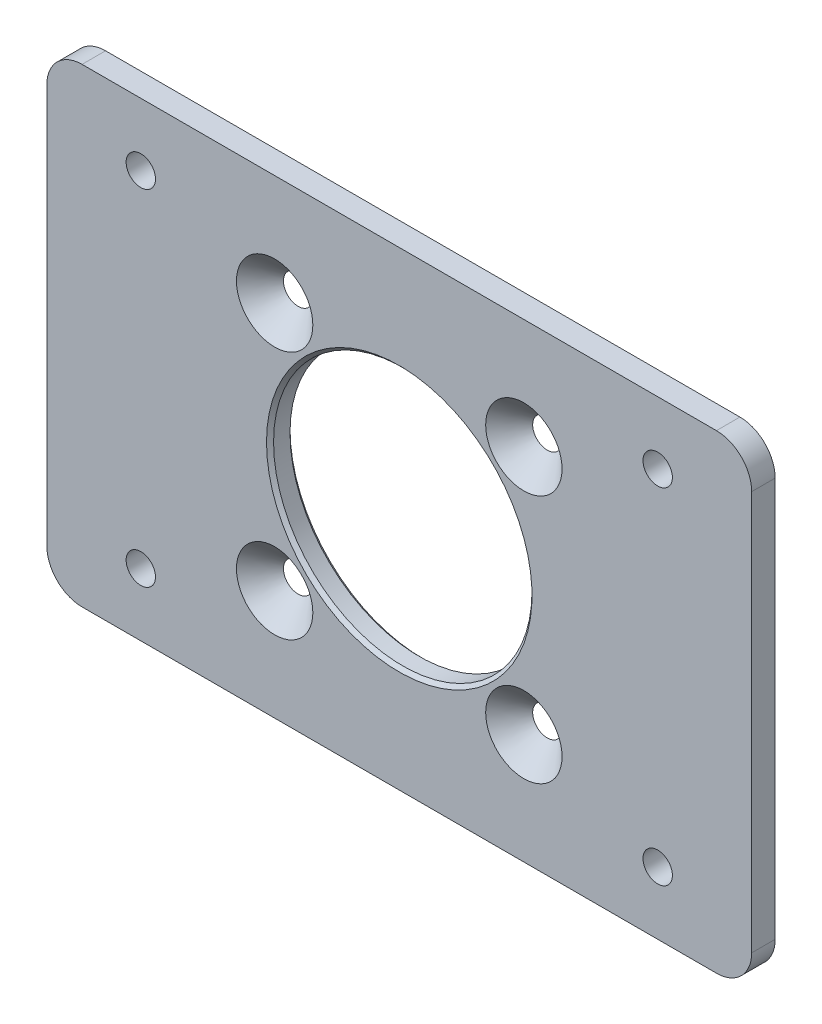
ISO-10303-21;
HEADER;
FILE_DESCRIPTION(('STEP AP214'),'2;1');
FILE_NAME('part.step','',(''),(''),'','','');
FILE_SCHEMA(('AUTOMOTIVE_DESIGN { 1 0 10303 214 1 1 1 1 }'));
ENDSEC;
DATA;
#1=APPLICATION_CONTEXT('core data for automotive mechanical design processes');
#2=APPLICATION_PROTOCOL_DEFINITION('international standard','automotive_design',2000,#1);
#3=PRODUCT_CONTEXT('',#1,'mechanical');
#4=PRODUCT('Part','Part','',(#3));
#5=PRODUCT_RELATED_PRODUCT_CATEGORY('part','',(#4));
#6=PRODUCT_DEFINITION_FORMATION('','',#4);
#7=PRODUCT_DEFINITION_CONTEXT('part definition',#1,'design');
#8=PRODUCT_DEFINITION('design','',#6,#7);
#9=PRODUCT_DEFINITION_SHAPE('','',#8);
#10=(LENGTH_UNIT() NAMED_UNIT(*) SI_UNIT(.MILLI.,.METRE.));
#11=(NAMED_UNIT(*) PLANE_ANGLE_UNIT() SI_UNIT($,.RADIAN.));
#12=(NAMED_UNIT(*) SI_UNIT($,.STERADIAN.) SOLID_ANGLE_UNIT());
#13=UNCERTAINTY_MEASURE_WITH_UNIT(LENGTH_MEASURE(1.E-05),#10,'distance_accuracy_value','');
#14=(GEOMETRIC_REPRESENTATION_CONTEXT(3) GLOBAL_UNCERTAINTY_ASSIGNED_CONTEXT((#13)) GLOBAL_UNIT_ASSIGNED_CONTEXT((#10,
#11,#12)) REPRESENTATION_CONTEXT('',''));
#15=CARTESIAN_POINT('',(0.,0.,0.));
#16=DIRECTION('',(0.,0.,1.));
#17=DIRECTION('',(1.,0.,0.));
#18=AXIS2_PLACEMENT_3D('',#15,#16,#17);
#19=CARTESIAN_POINT('',(27.,17.,2.));
#20=DIRECTION('',(0.,0.,-1.));
#21=DIRECTION('',(-1.,0.,0.));
#22=AXIS2_PLACEMENT_3D('',#19,#20,#21);
#23=PLANE('',#22);
#24=CARTESIAN_POINT('',(-10.6066017177974,-10.6066017177975,2.));
#25=DIRECTION('',(0.,0.,-1.));
#26=DIRECTION('',(-1.,0.,0.));
#27=AXIS2_PLACEMENT_3D('',#24,#25,#26);
#28=CIRCLE('',#27,3.25000000000056);
#29=CARTESIAN_POINT('',(-13.8566017177979,-10.6066017177975,2.));
#30=VERTEX_POINT('',#29);
#31=EDGE_CURVE('E11',#30,#30,#28,.T.);
#32=ORIENTED_EDGE('',*,*,#31,.T.);
#33=EDGE_LOOP('',(#32));
#34=FACE_BOUND('',#33,.T.);
#35=CARTESIAN_POINT('',(10.6066017177975,-10.6066017177974,2.));
#36=DIRECTION('',(0.,0.,-1.));
#37=DIRECTION('',(-1.,0.,0.));
#38=AXIS2_PLACEMENT_3D('',#35,#36,#37);
#39=CIRCLE('',#38,3.25000000000129);
#40=CARTESIAN_POINT('',(7.35660171779619,-10.6066017177974,2.));
#41=VERTEX_POINT('',#40);
#42=EDGE_CURVE('E41',#41,#41,#39,.T.);
#43=ORIENTED_EDGE('',*,*,#42,.T.);
#44=EDGE_LOOP('',(#43));
#45=FACE_BOUND('',#44,.T.);
#46=CARTESIAN_POINT('',(10.6066017177974,10.6066017177974,2.));
#47=DIRECTION('',(0.,0.,-1.));
#48=DIRECTION('',(-1.,0.,0.));
#49=AXIS2_PLACEMENT_3D('',#46,#47,#48);
#50=CIRCLE('',#49,3.25000000000184);
#51=CARTESIAN_POINT('',(7.35660171779552,10.6066017177974,2.));
#52=VERTEX_POINT('',#51);
#53=EDGE_CURVE('E175',#52,#52,#50,.T.);
#54=ORIENTED_EDGE('',*,*,#53,.T.);
#55=EDGE_LOOP('',(#54));
#56=FACE_BOUND('',#55,.T.);
#57=CARTESIAN_POINT('',(-10.6066017177975,10.6066017177973,2.));
#58=DIRECTION('',(0.,0.,-1.));
#59=DIRECTION('',(-1.,0.,0.));
#60=AXIS2_PLACEMENT_3D('',#57,#58,#59);
#61=CIRCLE('',#60,3.25000000000109);
#62=CARTESIAN_POINT('',(-13.8566017177986,10.6066017177973,2.));
#63=VERTEX_POINT('',#62);
#64=EDGE_CURVE('E172',#63,#63,#61,.T.);
#65=ORIENTED_EDGE('',*,*,#64,.T.);
#66=EDGE_LOOP('',(#65));
#67=FACE_BOUND('',#66,.T.);
#68=CARTESIAN_POINT('',(0.,0.,2.));
#69=DIRECTION('',(0.,0.,-1.));
#70=DIRECTION('',(-1.,0.,0.));
#71=AXIS2_PLACEMENT_3D('',#68,#69,#70);
#72=CIRCLE('',#71,11.3000000000001);
#73=CARTESIAN_POINT('',(-11.3000000000001,0.,2.));
#74=VERTEX_POINT('',#73);
#75=EDGE_CURVE('E166',#74,#74,#72,.T.);
#76=ORIENTED_EDGE('',*,*,#75,.T.);
#77=EDGE_LOOP('',(#76));
#78=FACE_BOUND('',#77,.T.);
#79=CARTESIAN_POINT('',(27.,17.,2.));
#80=DIRECTION('',(0.,0.,1.));
#81=DIRECTION('',(-1.,0.,0.));
#82=AXIS2_PLACEMENT_3D('',#79,#80,#81);
#83=CIRCLE('',#82,3.);
#84=CARTESIAN_POINT('',(30.,17.,2.));
#85=VERTEX_POINT('',#84);
#86=CARTESIAN_POINT('',(27.,20.,2.));
#87=VERTEX_POINT('',#86);
#88=EDGE_CURVE('E145',#85,#87,#83,.T.);
#89=ORIENTED_EDGE('',*,*,#88,.T.);
#90=DIRECTION('',(-1.,0.,0.));
#91=VECTOR('',#90,1.);
#92=CARTESIAN_POINT('',(-27.,20.,2.));
#93=LINE('',#92,#91);
#94=CARTESIAN_POINT('',(-27.,20.,2.));
#95=VERTEX_POINT('',#94);
#96=EDGE_CURVE('E93',#87,#95,#93,.T.);
#97=ORIENTED_EDGE('',*,*,#96,.T.);
#98=CARTESIAN_POINT('',(-27.,17.,2.));
#99=DIRECTION('',(0.,0.,1.));
#100=DIRECTION('',(-1.,0.,0.));
#101=AXIS2_PLACEMENT_3D('',#98,#99,#100);
#102=CIRCLE('',#101,3.);
#103=CARTESIAN_POINT('',(-30.,17.,2.));
#104=VERTEX_POINT('',#103);
#105=EDGE_CURVE('E203',#95,#104,#102,.T.);
#106=ORIENTED_EDGE('',*,*,#105,.T.);
#107=DIRECTION('',(0.,-1.,0.));
#108=VECTOR('',#107,1.);
#109=CARTESIAN_POINT('',(-30.,-17.,2.));
#110=LINE('',#109,#108);
#111=CARTESIAN_POINT('',(-30.,-17.,2.));
#112=VERTEX_POINT('',#111);
#113=EDGE_CURVE('E205',#104,#112,#110,.T.);
#114=ORIENTED_EDGE('',*,*,#113,.T.);
#115=CARTESIAN_POINT('',(-27.,-17.,2.));
#116=DIRECTION('',(0.,0.,1.));
#117=DIRECTION('',(-1.,0.,0.));
#118=AXIS2_PLACEMENT_3D('',#115,#116,#117);
#119=CIRCLE('',#118,3.);
#120=CARTESIAN_POINT('',(-27.,-20.,2.));
#121=VERTEX_POINT('',#120);
#122=EDGE_CURVE('E112',#112,#121,#119,.T.);
#123=ORIENTED_EDGE('',*,*,#122,.T.);
#124=DIRECTION('',(1.,0.,0.));
#125=VECTOR('',#124,1.);
#126=CARTESIAN_POINT('',(-27.,-20.,2.));
#127=LINE('',#126,#125);
#128=CARTESIAN_POINT('',(27.,-20.,2.));
#129=VERTEX_POINT('',#128);
#130=EDGE_CURVE('E106',#121,#129,#127,.T.);
#131=ORIENTED_EDGE('',*,*,#130,.T.);
#132=CARTESIAN_POINT('',(27.,-17.,2.));
#133=DIRECTION('',(0.,0.,1.));
#134=DIRECTION('',(1.,0.,0.));
#135=AXIS2_PLACEMENT_3D('',#132,#133,#134);
#136=CIRCLE('',#135,3.);
#137=CARTESIAN_POINT('',(30.,-17.,2.));
#138=VERTEX_POINT('',#137);
#139=EDGE_CURVE('E110',#129,#138,#136,.T.);
#140=ORIENTED_EDGE('',*,*,#139,.T.);
#141=DIRECTION('',(0.,1.,0.));
#142=VECTOR('',#141,1.);
#143=CARTESIAN_POINT('',(30.,-17.,2.));
#144=LINE('',#143,#142);
#145=EDGE_CURVE('E49',#138,#85,#144,.T.);
#146=ORIENTED_EDGE('',*,*,#145,.T.);
#147=EDGE_LOOP('',(#89,#97,#106,#114,#123,#131,#140,#146));
#148=FACE_BOUND('',#147,.T.);
#149=CARTESIAN_POINT('',(-22.,14.6666666666667,2.));
#150=DIRECTION('',(0.,0.,1.));
#151=DIRECTION('',(1.,0.,0.));
#152=AXIS2_PLACEMENT_3D('',#149,#150,#151);
#153=CIRCLE('',#152,1.25);
#154=CARTESIAN_POINT('',(-20.75,14.6666666666667,2.));
#155=VERTEX_POINT('',#154);
#156=EDGE_CURVE('E291',#155,#155,#153,.T.);
#157=ORIENTED_EDGE('',*,*,#156,.F.);
#158=EDGE_LOOP('',(#157));
#159=FACE_BOUND('',#158,.T.);
#160=CARTESIAN_POINT('',(22.,14.6666666666667,2.));
#161=DIRECTION('',(0.,0.,1.));
#162=DIRECTION('',(1.,0.,0.));
#163=AXIS2_PLACEMENT_3D('',#160,#161,#162);
#164=CIRCLE('',#163,1.25);
#165=CARTESIAN_POINT('',(23.25,14.6666666666667,2.));
#166=VERTEX_POINT('',#165);
#167=EDGE_CURVE('E285',#166,#166,#164,.T.);
#168=ORIENTED_EDGE('',*,*,#167,.F.);
#169=EDGE_LOOP('',(#168));
#170=FACE_BOUND('',#169,.T.);
#171=CARTESIAN_POINT('',(22.,-14.6666666666667,2.));
#172=DIRECTION('',(0.,0.,1.));
#173=DIRECTION('',(1.,0.,0.));
#174=AXIS2_PLACEMENT_3D('',#171,#172,#173);
#175=CIRCLE('',#174,1.25);
#176=CARTESIAN_POINT('',(23.25,-14.6666666666667,2.));
#177=VERTEX_POINT('',#176);
#178=EDGE_CURVE('E279',#177,#177,#175,.T.);
#179=ORIENTED_EDGE('',*,*,#178,.F.);
#180=EDGE_LOOP('',(#179));
#181=FACE_BOUND('',#180,.T.);
#182=CARTESIAN_POINT('',(-22.,-14.6666666666667,2.));
#183=DIRECTION('',(0.,0.,1.));
#184=DIRECTION('',(1.,0.,0.));
#185=AXIS2_PLACEMENT_3D('',#182,#183,#184);
#186=CIRCLE('',#185,1.25);
#187=CARTESIAN_POINT('',(-20.75,-14.6666666666667,2.));
#188=VERTEX_POINT('',#187);
#189=EDGE_CURVE('E270',#188,#188,#186,.T.);
#190=ORIENTED_EDGE('',*,*,#189,.F.);
#191=EDGE_LOOP('',(#190));
#192=FACE_BOUND('',#191,.T.);
#193=ADVANCED_FACE('F32',(#34,#45,#56,#67,#78,#148,#159,#170,#181,#192),#23,.F.);
#194=CARTESIAN_POINT('',(27.,17.,0.));
#195=DIRECTION('',(0.,0.,-1.));
#196=DIRECTION('',(-1.,0.,0.));
#197=AXIS2_PLACEMENT_3D('',#194,#195,#196);
#198=PLANE('',#197);
#199=CARTESIAN_POINT('',(0.,0.,0.));
#200=DIRECTION('',(0.,0.,-1.));
#201=DIRECTION('',(-1.,0.,0.));
#202=AXIS2_PLACEMENT_3D('',#199,#200,#201);
#203=CIRCLE('',#202,11.3000000000001);
#204=CARTESIAN_POINT('',(-11.3000000000001,0.,0.));
#205=VERTEX_POINT('',#204);
#206=EDGE_CURVE('E169',#205,#205,#203,.F.);
#207=ORIENTED_EDGE('',*,*,#206,.T.);
#208=EDGE_LOOP('',(#207));
#209=FACE_BOUND('',#208,.T.);
#210=CARTESIAN_POINT('',(22.,14.6666666666667,0.));
#211=DIRECTION('',(0.,0.,1.));
#212=DIRECTION('',(1.,0.,0.));
#213=AXIS2_PLACEMENT_3D('',#210,#211,#212);
#214=CIRCLE('',#213,1.25);
#215=CARTESIAN_POINT('',(23.25,14.6666666666667,0.));
#216=VERTEX_POINT('',#215);
#217=EDGE_CURVE('E282',#216,#216,#214,.T.);
#218=ORIENTED_EDGE('',*,*,#217,.T.);
#219=EDGE_LOOP('',(#218));
#220=FACE_BOUND('',#219,.T.);
#221=CARTESIAN_POINT('',(-10.6066017177975,10.6066017177973,0.));
#222=DIRECTION('',(0.,0.,1.));
#223=DIRECTION('',(1.,0.,0.));
#224=AXIS2_PLACEMENT_3D('',#221,#222,#223);
#225=CIRCLE('',#224,1.2500000000011);
#226=CARTESIAN_POINT('',(-9.35660171779638,10.6066017177973,0.));
#227=VERTEX_POINT('',#226);
#228=EDGE_CURVE('E197',#227,#227,#225,.T.);
#229=ORIENTED_EDGE('',*,*,#228,.T.);
#230=EDGE_LOOP('',(#229));
#231=FACE_BOUND('',#230,.T.);
#232=CARTESIAN_POINT('',(10.6066017177975,-10.6066017177974,0.));
#233=DIRECTION('',(0.,0.,1.));
#234=DIRECTION('',(1.,0.,0.));
#235=AXIS2_PLACEMENT_3D('',#232,#233,#234);
#236=CIRCLE('',#235,1.25000000000128);
#237=CARTESIAN_POINT('',(11.8566017177988,-10.6066017177974,0.));
#238=VERTEX_POINT('',#237);
#239=EDGE_CURVE('E190',#238,#238,#236,.T.);
#240=ORIENTED_EDGE('',*,*,#239,.T.);
#241=EDGE_LOOP('',(#240));
#242=FACE_BOUND('',#241,.T.);
#243=CARTESIAN_POINT('',(27.,17.,0.));
#244=DIRECTION('',(0.,0.,1.));
#245=DIRECTION('',(-1.,0.,0.));
#246=AXIS2_PLACEMENT_3D('',#243,#244,#245);
#247=CIRCLE('',#246,3.);
#248=CARTESIAN_POINT('',(30.,17.,0.));
#249=VERTEX_POINT('',#248);
#250=CARTESIAN_POINT('',(27.,20.,0.));
#251=VERTEX_POINT('',#250);
#252=EDGE_CURVE('E130',#249,#251,#247,.T.);
#253=ORIENTED_EDGE('',*,*,#252,.F.);
#254=DIRECTION('',(0.,1.,0.));
#255=VECTOR('',#254,1.);
#256=CARTESIAN_POINT('',(30.,-17.,0.));
#257=LINE('',#256,#255);
#258=CARTESIAN_POINT('',(30.,-17.,0.));
#259=VERTEX_POINT('',#258);
#260=EDGE_CURVE('E84',#259,#249,#257,.T.);
#261=ORIENTED_EDGE('',*,*,#260,.F.);
#262=CARTESIAN_POINT('',(27.,-17.,0.));
#263=DIRECTION('',(0.,0.,1.));
#264=DIRECTION('',(1.,0.,0.));
#265=AXIS2_PLACEMENT_3D('',#262,#263,#264);
#266=CIRCLE('',#265,3.);
#267=CARTESIAN_POINT('',(27.,-20.,0.));
#268=VERTEX_POINT('',#267);
#269=EDGE_CURVE('E78',#268,#259,#266,.T.);
#270=ORIENTED_EDGE('',*,*,#269,.F.);
#271=DIRECTION('',(1.,0.,0.));
#272=VECTOR('',#271,1.);
#273=CARTESIAN_POINT('',(-27.,-20.,0.));
#274=LINE('',#273,#272);
#275=CARTESIAN_POINT('',(-27.,-20.,0.));
#276=VERTEX_POINT('',#275);
#277=EDGE_CURVE('E120',#276,#268,#274,.T.);
#278=ORIENTED_EDGE('',*,*,#277,.F.);
#279=CARTESIAN_POINT('',(-27.,-17.,0.));
#280=DIRECTION('',(0.,0.,1.));
#281=DIRECTION('',(-1.,0.,0.));
#282=AXIS2_PLACEMENT_3D('',#279,#280,#281);
#283=CIRCLE('',#282,3.);
#284=CARTESIAN_POINT('',(-30.,-17.,0.));
#285=VERTEX_POINT('',#284);
#286=EDGE_CURVE('E140',#285,#276,#283,.T.);
#287=ORIENTED_EDGE('',*,*,#286,.F.);
#288=DIRECTION('',(0.,-1.,0.));
#289=VECTOR('',#288,1.);
#290=CARTESIAN_POINT('',(-30.,-17.,0.));
#291=LINE('',#290,#289);
#292=CARTESIAN_POINT('',(-30.,17.,0.));
#293=VERTEX_POINT('',#292);
#294=EDGE_CURVE('E138',#293,#285,#291,.T.);
#295=ORIENTED_EDGE('',*,*,#294,.F.);
#296=CARTESIAN_POINT('',(-27.,17.,0.));
#297=DIRECTION('',(0.,0.,1.));
#298=DIRECTION('',(-1.,0.,0.));
#299=AXIS2_PLACEMENT_3D('',#296,#297,#298);
#300=CIRCLE('',#299,3.);
#301=CARTESIAN_POINT('',(-27.,20.,0.));
#302=VERTEX_POINT('',#301);
#303=EDGE_CURVE('E136',#302,#293,#300,.T.);
#304=ORIENTED_EDGE('',*,*,#303,.F.);
#305=DIRECTION('',(-1.,0.,0.));
#306=VECTOR('',#305,1.);
#307=CARTESIAN_POINT('',(-27.,20.,0.));
#308=LINE('',#307,#306);
#309=EDGE_CURVE('E133',#251,#302,#308,.T.);
#310=ORIENTED_EDGE('',*,*,#309,.F.);
#311=EDGE_LOOP('',(#253,#261,#270,#278,#287,#295,#304,#310));
#312=FACE_BOUND('',#311,.T.);
#313=CARTESIAN_POINT('',(-10.6066017177974,-10.6066017177975,0.));
#314=DIRECTION('',(0.,0.,1.));
#315=DIRECTION('',(1.,0.,0.));
#316=AXIS2_PLACEMENT_3D('',#313,#314,#315);
#317=CIRCLE('',#316,1.25000000000057);
#318=CARTESIAN_POINT('',(-9.35660171779679,-10.6066017177975,0.));
#319=VERTEX_POINT('',#318);
#320=EDGE_CURVE('E134',#319,#319,#317,.T.);
#321=ORIENTED_EDGE('',*,*,#320,.T.);
#322=EDGE_LOOP('',(#321));
#323=FACE_BOUND('',#322,.T.);
#324=CARTESIAN_POINT('',(10.6066017177974,10.6066017177974,0.));
#325=DIRECTION('',(0.,0.,1.));
#326=DIRECTION('',(1.,0.,0.));
#327=AXIS2_PLACEMENT_3D('',#324,#325,#326);
#328=CIRCLE('',#327,1.25000000000184);
#329=CARTESIAN_POINT('',(11.8566017177992,10.6066017177974,0.));
#330=VERTEX_POINT('',#329);
#331=EDGE_CURVE('E192',#330,#330,#328,.T.);
#332=ORIENTED_EDGE('',*,*,#331,.T.);
#333=EDGE_LOOP('',(#332));
#334=FACE_BOUND('',#333,.T.);
#335=CARTESIAN_POINT('',(-22.,14.6666666666667,0.));
#336=DIRECTION('',(0.,0.,1.));
#337=DIRECTION('',(1.,0.,0.));
#338=AXIS2_PLACEMENT_3D('',#335,#336,#337);
#339=CIRCLE('',#338,1.25);
#340=CARTESIAN_POINT('',(-20.75,14.6666666666667,0.));
#341=VERTEX_POINT('',#340);
#342=EDGE_CURVE('E288',#341,#341,#339,.T.);
#343=ORIENTED_EDGE('',*,*,#342,.T.);
#344=EDGE_LOOP('',(#343));
#345=FACE_BOUND('',#344,.T.);
#346=CARTESIAN_POINT('',(22.,-14.6666666666667,0.));
#347=DIRECTION('',(0.,0.,1.));
#348=DIRECTION('',(1.,0.,0.));
#349=AXIS2_PLACEMENT_3D('',#346,#347,#348);
#350=CIRCLE('',#349,1.25);
#351=CARTESIAN_POINT('',(23.25,-14.6666666666667,0.));
#352=VERTEX_POINT('',#351);
#353=EDGE_CURVE('E276',#352,#352,#350,.T.);
#354=ORIENTED_EDGE('',*,*,#353,.T.);
#355=EDGE_LOOP('',(#354));
#356=FACE_BOUND('',#355,.T.);
#357=CARTESIAN_POINT('',(-22.,-14.6666666666667,0.));
#358=DIRECTION('',(0.,0.,1.));
#359=DIRECTION('',(1.,0.,0.));
#360=AXIS2_PLACEMENT_3D('',#357,#358,#359);
#361=CIRCLE('',#360,1.25);
#362=CARTESIAN_POINT('',(-20.75,-14.6666666666667,0.));
#363=VERTEX_POINT('',#362);
#364=EDGE_CURVE('E273',#363,#363,#361,.T.);
#365=ORIENTED_EDGE('',*,*,#364,.T.);
#366=EDGE_LOOP('',(#365));
#367=FACE_BOUND('',#366,.T.);
#368=ADVANCED_FACE('F218',(#209,#220,#231,#242,#312,#323,#334,#345,#356,#367),#198,.T.);
#369=CARTESIAN_POINT('',(27.,17.,2.));
#370=DIRECTION('',(0.,0.,-1.));
#371=DIRECTION('',(-1.,0.,0.));
#372=AXIS2_PLACEMENT_3D('',#369,#370,#371);
#373=CYLINDRICAL_SURFACE('',#372,3.);
#374=ORIENTED_EDGE('',*,*,#252,.T.);
#375=DIRECTION('',(0.,0.,-1.));
#376=VECTOR('',#375,1.);
#377=CARTESIAN_POINT('',(27.,20.,2.));
#378=LINE('',#377,#376);
#379=EDGE_CURVE('E158',#87,#251,#378,.T.);
#380=ORIENTED_EDGE('',*,*,#379,.F.);
#381=ORIENTED_EDGE('',*,*,#88,.F.);
#382=DIRECTION('',(0.,0.,-1.));
#383=VECTOR('',#382,1.);
#384=CARTESIAN_POINT('',(30.,17.,2.));
#385=LINE('',#384,#383);
#386=EDGE_CURVE('E126',#85,#249,#385,.T.);
#387=ORIENTED_EDGE('',*,*,#386,.T.);
#388=EDGE_LOOP('',(#374,#380,#381,#387));
#389=FACE_BOUND('',#388,.T.);
#390=ADVANCED_FACE('F223',(#389),#373,.T.);
#391=CARTESIAN_POINT('',(-27.,20.,2.));
#392=DIRECTION('',(0.,-1.,0.));
#393=DIRECTION('',(0.,0.,-1.));
#394=AXIS2_PLACEMENT_3D('',#391,#392,#393);
#395=PLANE('',#394);
#396=ORIENTED_EDGE('',*,*,#309,.T.);
#397=DIRECTION('',(0.,0.,-1.));
#398=VECTOR('',#397,1.);
#399=CARTESIAN_POINT('',(-27.,20.,2.));
#400=LINE('',#399,#398);
#401=EDGE_CURVE('E155',#95,#302,#400,.T.);
#402=ORIENTED_EDGE('',*,*,#401,.F.);
#403=ORIENTED_EDGE('',*,*,#96,.F.);
#404=ORIENTED_EDGE('',*,*,#379,.T.);
#405=EDGE_LOOP('',(#396,#402,#403,#404));
#406=FACE_BOUND('',#405,.T.);
#407=ADVANCED_FACE('F329',(#406),#395,.F.);
#408=CARTESIAN_POINT('',(-27.,17.,2.));
#409=DIRECTION('',(0.,0.,-1.));
#410=DIRECTION('',(-1.,0.,0.));
#411=AXIS2_PLACEMENT_3D('',#408,#409,#410);
#412=CYLINDRICAL_SURFACE('',#411,3.);
#413=ORIENTED_EDGE('',*,*,#303,.T.);
#414=DIRECTION('',(0.,0.,-1.));
#415=VECTOR('',#414,1.);
#416=CARTESIAN_POINT('',(-30.,17.,2.));
#417=LINE('',#416,#415);
#418=EDGE_CURVE('E152',#104,#293,#417,.T.);
#419=ORIENTED_EDGE('',*,*,#418,.F.);
#420=ORIENTED_EDGE('',*,*,#105,.F.);
#421=ORIENTED_EDGE('',*,*,#401,.T.);
#422=EDGE_LOOP('',(#413,#419,#420,#421));
#423=FACE_BOUND('',#422,.T.);
#424=ADVANCED_FACE('F332',(#423),#412,.T.);
#425=CARTESIAN_POINT('',(-30.,-17.,2.));
#426=DIRECTION('',(1.,0.,0.));
#427=DIRECTION('',(0.,0.,-1.));
#428=AXIS2_PLACEMENT_3D('',#425,#426,#427);
#429=PLANE('',#428);
#430=ORIENTED_EDGE('',*,*,#294,.T.);
#431=DIRECTION('',(0.,0.,-1.));
#432=VECTOR('',#431,1.);
#433=CARTESIAN_POINT('',(-30.,-17.,2.));
#434=LINE('',#433,#432);
#435=EDGE_CURVE('E149',#112,#285,#434,.T.);
#436=ORIENTED_EDGE('',*,*,#435,.F.);
#437=ORIENTED_EDGE('',*,*,#113,.F.);
#438=ORIENTED_EDGE('',*,*,#418,.T.);
#439=EDGE_LOOP('',(#430,#436,#437,#438));
#440=FACE_BOUND('',#439,.T.);
#441=ADVANCED_FACE('F211',(#440),#429,.F.);
#442=CARTESIAN_POINT('',(-27.,-17.,2.));
#443=DIRECTION('',(0.,0.,-1.));
#444=DIRECTION('',(-1.,0.,0.));
#445=AXIS2_PLACEMENT_3D('',#442,#443,#444);
#446=CYLINDRICAL_SURFACE('',#445,3.);
#447=ORIENTED_EDGE('',*,*,#286,.T.);
#448=DIRECTION('',(0.,0.,-1.));
#449=VECTOR('',#448,1.);
#450=CARTESIAN_POINT('',(-27.,-20.,2.));
#451=LINE('',#450,#449);
#452=EDGE_CURVE('E121',#121,#276,#451,.T.);
#453=ORIENTED_EDGE('',*,*,#452,.F.);
#454=ORIENTED_EDGE('',*,*,#122,.F.);
#455=ORIENTED_EDGE('',*,*,#435,.T.);
#456=EDGE_LOOP('',(#447,#453,#454,#455));
#457=FACE_BOUND('',#456,.T.);
#458=ADVANCED_FACE('F215',(#457),#446,.T.);
#459=CARTESIAN_POINT('',(-27.,-20.,2.));
#460=DIRECTION('',(0.,1.,0.));
#461=DIRECTION('',(0.,0.,1.));
#462=AXIS2_PLACEMENT_3D('',#459,#460,#461);
#463=PLANE('',#462);
#464=ORIENTED_EDGE('',*,*,#277,.T.);
#465=DIRECTION('',(0.,0.,-1.));
#466=VECTOR('',#465,1.);
#467=CARTESIAN_POINT('',(27.,-20.,2.));
#468=LINE('',#467,#466);
#469=EDGE_CURVE('E117',#129,#268,#468,.T.);
#470=ORIENTED_EDGE('',*,*,#469,.F.);
#471=ORIENTED_EDGE('',*,*,#130,.F.);
#472=ORIENTED_EDGE('',*,*,#452,.T.);
#473=EDGE_LOOP('',(#464,#470,#471,#472));
#474=FACE_BOUND('',#473,.T.);
#475=ADVANCED_FACE('F118',(#474),#463,.F.);
#476=CARTESIAN_POINT('',(27.,-17.,2.));
#477=DIRECTION('',(0.,0.,-1.));
#478=DIRECTION('',(-1.,0.,0.));
#479=AXIS2_PLACEMENT_3D('',#476,#477,#478);
#480=CYLINDRICAL_SURFACE('',#479,3.);
#481=ORIENTED_EDGE('',*,*,#269,.T.);
#482=DIRECTION('',(0.,0.,-1.));
#483=VECTOR('',#482,1.);
#484=CARTESIAN_POINT('',(30.,-17.,2.));
#485=LINE('',#484,#483);
#486=EDGE_CURVE('E122',#138,#259,#485,.T.);
#487=ORIENTED_EDGE('',*,*,#486,.F.);
#488=ORIENTED_EDGE('',*,*,#139,.F.);
#489=ORIENTED_EDGE('',*,*,#469,.T.);
#490=EDGE_LOOP('',(#481,#487,#488,#489));
#491=FACE_BOUND('',#490,.T.);
#492=ADVANCED_FACE('F124',(#491),#480,.T.);
#493=CARTESIAN_POINT('',(30.,-17.,2.));
#494=DIRECTION('',(-1.,0.,0.));
#495=DIRECTION('',(0.,0.,1.));
#496=AXIS2_PLACEMENT_3D('',#493,#494,#495);
#497=PLANE('',#496);
#498=ORIENTED_EDGE('',*,*,#260,.T.);
#499=ORIENTED_EDGE('',*,*,#386,.F.);
#500=ORIENTED_EDGE('',*,*,#145,.F.);
#501=ORIENTED_EDGE('',*,*,#486,.T.);
#502=EDGE_LOOP('',(#498,#499,#500,#501));
#503=FACE_BOUND('',#502,.T.);
#504=ADVANCED_FACE('F225',(#503),#497,.F.);
#505=CARTESIAN_POINT('',(-22.,14.6666666666667,2.));
#506=DIRECTION('',(0.,0.,-1.));
#507=DIRECTION('',(-1.,0.,0.));
#508=AXIS2_PLACEMENT_3D('',#505,#506,#507);
#509=CYLINDRICAL_SURFACE('',#508,1.25);
#510=ORIENTED_EDGE('',*,*,#156,.T.);
#511=EDGE_LOOP('',(#510));
#512=FACE_BOUND('',#511,.T.);
#513=ORIENTED_EDGE('',*,*,#342,.F.);
#514=EDGE_LOOP('',(#513));
#515=FACE_BOUND('',#514,.T.);
#516=ADVANCED_FACE('F227',(#512,#515),#509,.F.);
#517=CARTESIAN_POINT('',(22.,14.6666666666667,2.));
#518=DIRECTION('',(0.,0.,-1.));
#519=DIRECTION('',(-1.,0.,0.));
#520=AXIS2_PLACEMENT_3D('',#517,#518,#519);
#521=CYLINDRICAL_SURFACE('',#520,1.25);
#522=ORIENTED_EDGE('',*,*,#167,.T.);
#523=EDGE_LOOP('',(#522));
#524=FACE_BOUND('',#523,.T.);
#525=ORIENTED_EDGE('',*,*,#217,.F.);
#526=EDGE_LOOP('',(#525));
#527=FACE_BOUND('',#526,.T.);
#528=ADVANCED_FACE('F233',(#524,#527),#521,.F.);
#529=CARTESIAN_POINT('',(22.,-14.6666666666667,2.));
#530=DIRECTION('',(0.,0.,-1.));
#531=DIRECTION('',(-1.,0.,0.));
#532=AXIS2_PLACEMENT_3D('',#529,#530,#531);
#533=CYLINDRICAL_SURFACE('',#532,1.25);
#534=ORIENTED_EDGE('',*,*,#178,.T.);
#535=EDGE_LOOP('',(#534));
#536=FACE_BOUND('',#535,.T.);
#537=ORIENTED_EDGE('',*,*,#353,.F.);
#538=EDGE_LOOP('',(#537));
#539=FACE_BOUND('',#538,.T.);
#540=ADVANCED_FACE('F248',(#536,#539),#533,.F.);
#541=CARTESIAN_POINT('',(0.,0.,2.));
#542=DIRECTION('',(0.,0.,-1.));
#543=DIRECTION('',(-1.,0.,0.));
#544=AXIS2_PLACEMENT_3D('',#541,#542,#543);
#545=CYLINDRICAL_SURFACE('',#544,11.0000000000001);
#546=CARTESIAN_POINT('',(0.,0.,1.7));
#547=DIRECTION('',(0.,0.,-1.));
#548=DIRECTION('',(-1.,0.,0.));
#549=AXIS2_PLACEMENT_3D('',#546,#547,#548);
#550=CIRCLE('',#549,11.0000000000001);
#551=CARTESIAN_POINT('',(-11.0000000000001,0.,1.7));
#552=VERTEX_POINT('',#551);
#553=EDGE_CURVE('E163',#552,#552,#550,.F.);
#554=ORIENTED_EDGE('',*,*,#553,.T.);
#555=EDGE_LOOP('',(#554));
#556=FACE_BOUND('',#555,.T.);
#557=CARTESIAN_POINT('',(0.,0.,0.300000000000014));
#558=DIRECTION('',(0.,0.,-1.));
#559=DIRECTION('',(-1.,0.,0.));
#560=AXIS2_PLACEMENT_3D('',#557,#558,#559);
#561=CIRCLE('',#560,11.0000000000001);
#562=CARTESIAN_POINT('',(-11.0000000000001,0.,0.300000000000014));
#563=VERTEX_POINT('',#562);
#564=EDGE_CURVE('E160',#563,#563,#561,.T.);
#565=ORIENTED_EDGE('',*,*,#564,.T.);
#566=EDGE_LOOP('',(#565));
#567=FACE_BOUND('',#566,.T.);
#568=ADVANCED_FACE('F252',(#556,#567),#545,.F.);
#569=CARTESIAN_POINT('',(-22.,-14.6666666666667,2.));
#570=DIRECTION('',(0.,0.,-1.));
#571=DIRECTION('',(-1.,0.,0.));
#572=AXIS2_PLACEMENT_3D('',#569,#570,#571);
#573=CYLINDRICAL_SURFACE('',#572,1.25);
#574=ORIENTED_EDGE('',*,*,#189,.T.);
#575=EDGE_LOOP('',(#574));
#576=FACE_BOUND('',#575,.T.);
#577=ORIENTED_EDGE('',*,*,#364,.F.);
#578=EDGE_LOOP('',(#577));
#579=FACE_BOUND('',#578,.T.);
#580=ADVANCED_FACE('F256',(#576,#579),#573,.F.);
#581=CARTESIAN_POINT('',(0.,0.,1.7));
#582=DIRECTION('',(0.,0.,1.));
#583=DIRECTION('',(1.,0.,0.));
#584=AXIS2_PLACEMENT_3D('',#581,#582,#583);
#585=CONICAL_SURFACE('',#584,11.0000000000001,0.785398163397454);
#586=ORIENTED_EDGE('',*,*,#75,.F.);
#587=EDGE_LOOP('',(#586));
#588=FACE_BOUND('',#587,.T.);
#589=ORIENTED_EDGE('',*,*,#553,.F.);
#590=EDGE_LOOP('',(#589));
#591=FACE_BOUND('',#590,.T.);
#592=ADVANCED_FACE('F259',(#588,#591),#585,.F.);
#593=CARTESIAN_POINT('',(0.,0.,0.));
#594=DIRECTION('',(0.,0.,-1.));
#595=DIRECTION('',(-1.,0.,0.));
#596=AXIS2_PLACEMENT_3D('',#593,#594,#595);
#597=CONICAL_SURFACE('',#596,11.3000000000001,0.785398163397448);
#598=ORIENTED_EDGE('',*,*,#564,.F.);
#599=EDGE_LOOP('',(#598));
#600=FACE_BOUND('',#599,.T.);
#601=ORIENTED_EDGE('',*,*,#206,.F.);
#602=EDGE_LOOP('',(#601));
#603=FACE_BOUND('',#602,.T.);
#604=ADVANCED_FACE('F264',(#600,#603),#597,.F.);
#605=CARTESIAN_POINT('',(-10.6066017177974,-10.6066017177975,0.));
#606=DIRECTION('',(0.,0.,1.));
#607=DIRECTION('',(1.,0.,0.));
#608=AXIS2_PLACEMENT_3D('',#605,#606,#607);
#609=CONICAL_SURFACE('',#608,1.25000000000057,0.785398163397451);
#610=ORIENTED_EDGE('',*,*,#31,.F.);
#611=EDGE_LOOP('',(#610));
#612=FACE_BOUND('',#611,.T.);
#613=ORIENTED_EDGE('',*,*,#320,.F.);
#614=EDGE_LOOP('',(#613));
#615=FACE_BOUND('',#614,.T.);
#616=ADVANCED_FACE('F186',(#612,#615),#609,.F.);
#617=CARTESIAN_POINT('',(10.6066017177975,-10.6066017177974,0.));
#618=DIRECTION('',(0.,0.,1.));
#619=DIRECTION('',(1.,0.,0.));
#620=AXIS2_PLACEMENT_3D('',#617,#618,#619);
#621=CONICAL_SURFACE('',#620,1.25000000000128,0.785398163397451);
#622=ORIENTED_EDGE('',*,*,#42,.F.);
#623=EDGE_LOOP('',(#622));
#624=FACE_BOUND('',#623,.T.);
#625=ORIENTED_EDGE('',*,*,#239,.F.);
#626=EDGE_LOOP('',(#625));
#627=FACE_BOUND('',#626,.T.);
#628=ADVANCED_FACE('F182',(#624,#627),#621,.F.);
#629=CARTESIAN_POINT('',(10.6066017177974,10.6066017177974,0.));
#630=DIRECTION('',(0.,0.,1.));
#631=DIRECTION('',(1.,0.,0.));
#632=AXIS2_PLACEMENT_3D('',#629,#630,#631);
#633=CONICAL_SURFACE('',#632,1.25000000000184,0.785398163397451);
#634=ORIENTED_EDGE('',*,*,#53,.F.);
#635=EDGE_LOOP('',(#634));
#636=FACE_BOUND('',#635,.T.);
#637=ORIENTED_EDGE('',*,*,#331,.F.);
#638=EDGE_LOOP('',(#637));
#639=FACE_BOUND('',#638,.T.);
#640=ADVANCED_FACE('F185',(#636,#639),#633,.F.);
#641=CARTESIAN_POINT('',(-10.6066017177975,10.6066017177973,0.));
#642=DIRECTION('',(0.,0.,1.));
#643=DIRECTION('',(1.,0.,0.));
#644=AXIS2_PLACEMENT_3D('',#641,#642,#643);
#645=CONICAL_SURFACE('',#644,1.2500000000011,0.785398163397451);
#646=ORIENTED_EDGE('',*,*,#64,.F.);
#647=EDGE_LOOP('',(#646));
#648=FACE_BOUND('',#647,.T.);
#649=ORIENTED_EDGE('',*,*,#228,.F.);
#650=EDGE_LOOP('',(#649));
#651=FACE_BOUND('',#650,.T.);
#652=ADVANCED_FACE('F34',(#648,#651),#645,.F.);
#653=CLOSED_SHELL('',(#193,#368,#390,#407,#424,#441,#458,#475,#492,#504,#516,#528,#540,#568,
#580,#592,#604,#616,#628,#640,#652));
#654=MANIFOLD_SOLID_BREP('B2',#653);
#655=ADVANCED_BREP_SHAPE_REPRESENTATION('',(#18,#654),#14);
#656=SHAPE_DEFINITION_REPRESENTATION(#9,#655);
ENDSEC;
END-ISO-10303-21;
